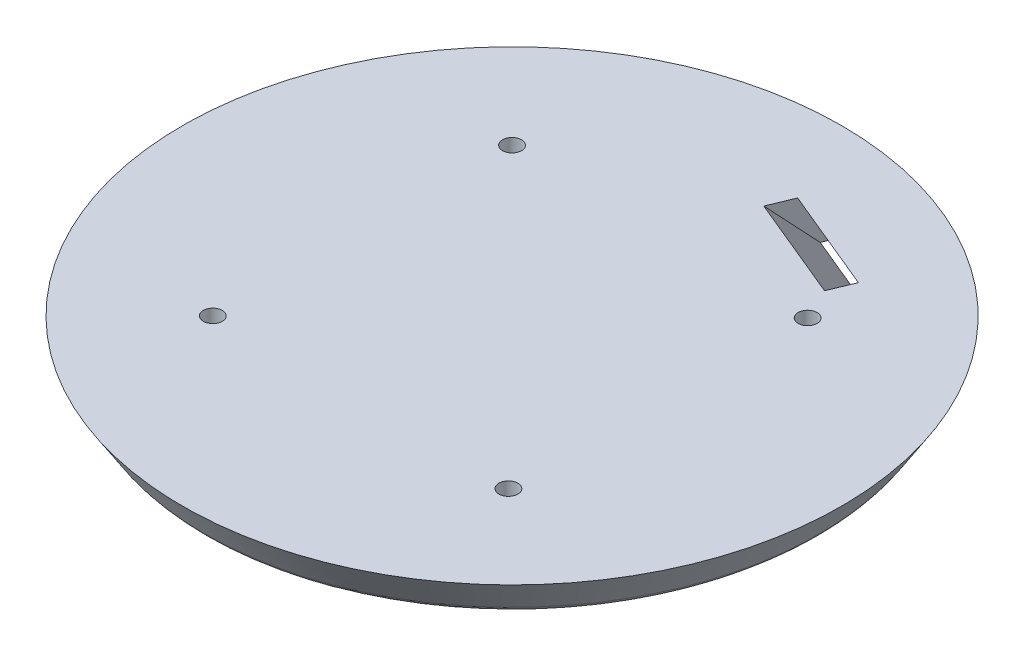
ISO-10303-21;
HEADER;
FILE_DESCRIPTION(('STEP AP214'),'2;1');
FILE_NAME('part.step','',(''),(''),'','','');
FILE_SCHEMA(('AUTOMOTIVE_DESIGN { 1 0 10303 214 1 1 1 1 }'));
ENDSEC;
DATA;
#1=APPLICATION_CONTEXT('core data for automotive mechanical design processes');
#2=APPLICATION_PROTOCOL_DEFINITION('international standard','automotive_design',2000,#1);
#3=PRODUCT_CONTEXT('',#1,'mechanical');
#4=PRODUCT('Part','Part','',(#3));
#5=PRODUCT_RELATED_PRODUCT_CATEGORY('part','',(#4));
#6=PRODUCT_DEFINITION_FORMATION('','',#4);
#7=PRODUCT_DEFINITION_CONTEXT('part definition',#1,'design');
#8=PRODUCT_DEFINITION('design','',#6,#7);
#9=PRODUCT_DEFINITION_SHAPE('','',#8);
#10=(LENGTH_UNIT() NAMED_UNIT(*) SI_UNIT(.MILLI.,.METRE.));
#11=(NAMED_UNIT(*) PLANE_ANGLE_UNIT() SI_UNIT($,.RADIAN.));
#12=(NAMED_UNIT(*) SI_UNIT($,.STERADIAN.) SOLID_ANGLE_UNIT());
#13=UNCERTAINTY_MEASURE_WITH_UNIT(LENGTH_MEASURE(1.E-05),#10,'distance_accuracy_value','');
#14=(GEOMETRIC_REPRESENTATION_CONTEXT(3) GLOBAL_UNCERTAINTY_ASSIGNED_CONTEXT((#13)) GLOBAL_UNIT_ASSIGNED_CONTEXT((#10,
#11,#12)) REPRESENTATION_CONTEXT('',''));
#15=CARTESIAN_POINT('',(0.,0.,0.));
#16=DIRECTION('',(0.,0.,1.));
#17=DIRECTION('',(1.,0.,0.));
#18=AXIS2_PLACEMENT_3D('',#15,#16,#17);
#19=CARTESIAN_POINT('',(0.,-9.99999999999999,0.));
#20=DIRECTION('',(0.,1.,0.));
#21=DIRECTION('',(0.,0.,1.));
#22=AXIS2_PLACEMENT_3D('',#19,#20,#21);
#23=PLANE('',#22);
#24=CARTESIAN_POINT('',(0.,-9.99999999999999,0.));
#25=DIRECTION('',(0.,-1.,0.));
#26=DIRECTION('',(0.,0.,-1.));
#27=AXIS2_PLACEMENT_3D('',#24,#25,#26);
#28=CIRCLE('',#27,33.8864389538999);
#29=CARTESIAN_POINT('',(0.,-9.99999999999999,-33.8864389538999));
#30=VERTEX_POINT('',#29);
#31=EDGE_CURVE('E306',#30,#30,#28,.T.);
#32=ORIENTED_EDGE('',*,*,#31,.T.);
#33=EDGE_LOOP('',(#32));
#34=FACE_BOUND('',#33,.T.);
#35=CARTESIAN_POINT('',(-17.3241161390704,-9.99999999999999,17.3241161390704));
#36=DIRECTION('',(0.,1.,0.));
#37=DIRECTION('',(0.,0.,1.));
#38=AXIS2_PLACEMENT_3D('',#35,#36,#37);
#39=CIRCLE('',#38,4.2);
#40=CARTESIAN_POINT('',(-17.3241161390704,-9.99999999999999,21.5241161390704));
#41=VERTEX_POINT('',#40);
#42=EDGE_CURVE('E315',#41,#41,#39,.T.);
#43=ORIENTED_EDGE('',*,*,#42,.T.);
#44=EDGE_LOOP('',(#43));
#45=FACE_BOUND('',#44,.T.);
#46=CARTESIAN_POINT('',(-17.1119841047144,-9.99999999999999,-17.1119841047145));
#47=DIRECTION('',(0.,1.,0.));
#48=DIRECTION('',(0.,0.,1.));
#49=AXIS2_PLACEMENT_3D('',#46,#47,#48);
#50=CIRCLE('',#49,4.2);
#51=CARTESIAN_POINT('',(-17.1119841047144,-9.99999999999999,-12.9119841047145));
#52=VERTEX_POINT('',#51);
#53=EDGE_CURVE('E165',#52,#52,#50,.T.);
#54=ORIENTED_EDGE('',*,*,#53,.T.);
#55=EDGE_LOOP('',(#54));
#56=FACE_BOUND('',#55,.T.);
#57=CARTESIAN_POINT('',(17.3241161390705,-9.99999999999999,-16.8998520703585));
#58=DIRECTION('',(0.,1.,0.));
#59=DIRECTION('',(0.,0.,1.));
#60=AXIS2_PLACEMENT_3D('',#57,#58,#59);
#61=CIRCLE('',#60,4.2);
#62=CARTESIAN_POINT('',(17.3241161390705,-9.99999999999999,-12.6998520703585));
#63=VERTEX_POINT('',#62);
#64=EDGE_CURVE('E322',#63,#63,#61,.T.);
#65=ORIENTED_EDGE('',*,*,#64,.T.);
#66=EDGE_LOOP('',(#65));
#67=FACE_BOUND('',#66,.T.);
#68=CARTESIAN_POINT('',(17.1119841047145,-9.99999999999999,17.5362481734264));
#69=DIRECTION('',(0.,1.,0.));
#70=DIRECTION('',(0.,0.,1.));
#71=AXIS2_PLACEMENT_3D('',#68,#69,#70);
#72=CIRCLE('',#71,4.2);
#73=CARTESIAN_POINT('',(17.1119841047145,-9.99999999999999,21.7362481734264));
#74=VERTEX_POINT('',#73);
#75=EDGE_CURVE('E174',#74,#74,#72,.T.);
#76=ORIENTED_EDGE('',*,*,#75,.T.);
#77=EDGE_LOOP('',(#76));
#78=FACE_BOUND('',#77,.T.);
#79=DIRECTION('',(-0.382683432365088,0.,0.923879532511288));
#80=VECTOR('',#79,1.);
#81=CARTESIAN_POINT('',(17.485719932276,-9.99999999999999,-25.2289436649656));
#82=LINE('',#81,#80);
#83=CARTESIAN_POINT('',(18.6337702293713,-9.99999999999999,-28.0005822624994));
#84=VERTEX_POINT('',#83);
#85=CARTESIAN_POINT('',(17.485719932276,-9.99999999999999,-25.2289436649656));
#86=VERTEX_POINT('',#85);
#87=EDGE_CURVE('E102',#84,#86,#82,.T.);
#88=ORIENTED_EDGE('',*,*,#87,.F.);
#89=DIRECTION('',(0.923879532511288,0.,0.382683432365088));
#90=VECTOR('',#89,1.);
#91=CARTESIAN_POINT('',(6.62333630672452,-9.99999999999999,-32.9754668832456));
#92=LINE('',#91,#90);
#93=CARTESIAN_POINT('',(6.62333630672452,-9.99999999999999,-32.9754668832456));
#94=VERTEX_POINT('',#93);
#95=EDGE_CURVE('E107',#94,#84,#92,.T.);
#96=ORIENTED_EDGE('',*,*,#95,.F.);
#97=DIRECTION('',(0.382683432365088,0.,-0.923879532511288));
#98=VECTOR('',#97,1.);
#99=CARTESIAN_POINT('',(5.47528600962925,-9.99999999999999,-30.2038282857117));
#100=LINE('',#99,#98);
#101=CARTESIAN_POINT('',(5.47528600962925,-9.99999999999999,-30.2038282857117));
#102=VERTEX_POINT('',#101);
#103=EDGE_CURVE('E110',#102,#94,#100,.T.);
#104=ORIENTED_EDGE('',*,*,#103,.F.);
#105=DIRECTION('',(-0.923879532511288,0.,-0.382683432365088));
#106=VECTOR('',#105,1.);
#107=CARTESIAN_POINT('',(5.47528600962925,-9.99999999999999,-30.2038282857117));
#108=LINE('',#107,#106);
#109=EDGE_CURVE('E46',#86,#102,#108,.T.);
#110=ORIENTED_EDGE('',*,*,#109,.F.);
#111=EDGE_LOOP('',(#88,#96,#104,#110));
#112=FACE_BOUND('',#111,.T.);
#113=ADVANCED_FACE('F42',(#34,#45,#56,#67,#78,#112),#23,.F.);
#114=CARTESIAN_POINT('',(0.,-5.,0.));
#115=DIRECTION('',(0.,-1.,0.));
#116=DIRECTION('',(0.,0.,-1.));
#117=AXIS2_PLACEMENT_3D('',#114,#115,#116);
#118=PLANE('',#117);
#119=CARTESIAN_POINT('',(0.,-5.,0.));
#120=DIRECTION('',(0.,-1.,0.));
#121=DIRECTION('',(0.,0.,-1.));
#122=AXIS2_PLACEMENT_3D('',#119,#120,#121);
#123=CIRCLE('',#122,38.16059492175);
#124=CARTESIAN_POINT('',(0.,-5.,-38.16059492175));
#125=VERTEX_POINT('',#124);
#126=EDGE_CURVE('E285',#125,#125,#123,.T.);
#127=ORIENTED_EDGE('',*,*,#126,.F.);
#128=EDGE_LOOP('',(#127));
#129=FACE_BOUND('',#128,.T.);
#130=CARTESIAN_POINT('',(17.3241161390705,-5.,-16.8998520703585));
#131=DIRECTION('',(0.,-1.,0.));
#132=DIRECTION('',(0.,0.,-1.));
#133=AXIS2_PLACEMENT_3D('',#130,#131,#132);
#134=CIRCLE('',#133,1.1);
#135=CARTESIAN_POINT('',(17.3241161390705,-5.,-17.9998520703585));
#136=VERTEX_POINT('',#135);
#137=EDGE_CURVE('E289',#136,#136,#134,.T.);
#138=ORIENTED_EDGE('',*,*,#137,.T.);
#139=EDGE_LOOP('',(#138));
#140=FACE_BOUND('',#139,.T.);
#141=CARTESIAN_POINT('',(17.1119841047145,-5.,17.5362481734264));
#142=DIRECTION('',(0.,-1.,0.));
#143=DIRECTION('',(0.,0.,-1.));
#144=AXIS2_PLACEMENT_3D('',#141,#142,#143);
#145=CIRCLE('',#144,1.1);
#146=CARTESIAN_POINT('',(17.1119841047145,-5.,16.4362481734264));
#147=VERTEX_POINT('',#146);
#148=EDGE_CURVE('E293',#147,#147,#145,.T.);
#149=ORIENTED_EDGE('',*,*,#148,.T.);
#150=EDGE_LOOP('',(#149));
#151=FACE_BOUND('',#150,.T.);
#152=CARTESIAN_POINT('',(-17.1119841047144,-5.,-17.1119841047145));
#153=DIRECTION('',(0.,-1.,0.));
#154=DIRECTION('',(0.,0.,-1.));
#155=AXIS2_PLACEMENT_3D('',#152,#153,#154);
#156=CIRCLE('',#155,1.1);
#157=CARTESIAN_POINT('',(-17.1119841047144,-5.,-18.2119841047145));
#158=VERTEX_POINT('',#157);
#159=EDGE_CURVE('E297',#158,#158,#156,.T.);
#160=ORIENTED_EDGE('',*,*,#159,.T.);
#161=EDGE_LOOP('',(#160));
#162=FACE_BOUND('',#161,.T.);
#163=CARTESIAN_POINT('',(-17.3241161390704,-5.,17.3241161390704));
#164=DIRECTION('',(0.,-1.,0.));
#165=DIRECTION('',(0.,0.,-1.));
#166=AXIS2_PLACEMENT_3D('',#163,#164,#165);
#167=CIRCLE('',#166,1.1);
#168=CARTESIAN_POINT('',(-17.3241161390704,-5.,16.2241161390704));
#169=VERTEX_POINT('',#168);
#170=EDGE_CURVE('E300',#169,#169,#167,.T.);
#171=ORIENTED_EDGE('',*,*,#170,.T.);
#172=EDGE_LOOP('',(#171));
#173=FACE_BOUND('',#172,.T.);
#174=DIRECTION('',(0.382683432365087,0.,-0.923879532511288));
#175=VECTOR('',#174,1.);
#176=CARTESIAN_POINT('',(16.7203530675458,-5.,-23.381184599943));
#177=LINE('',#176,#175);
#178=CARTESIAN_POINT('',(15.5723027704506,-5.,-20.6095460024091));
#179=VERTEX_POINT('',#178);
#180=CARTESIAN_POINT('',(16.7203530675458,-5.,-23.381184599943));
#181=VERTEX_POINT('',#180);
#182=EDGE_CURVE('E222',#179,#181,#177,.T.);
#183=ORIENTED_EDGE('',*,*,#182,.F.);
#184=DIRECTION('',(0.923879532511288,0.,0.382683432365087));
#185=VECTOR('',#184,1.);
#186=CARTESIAN_POINT('',(3.56186884780381,-5.,-25.5844306231553));
#187=LINE('',#186,#185);
#188=CARTESIAN_POINT('',(3.56186884780381,-5.,-25.5844306231553));
#189=VERTEX_POINT('',#188);
#190=EDGE_CURVE('E92',#189,#179,#187,.T.);
#191=ORIENTED_EDGE('',*,*,#190,.F.);
#192=DIRECTION('',(-0.382683432365087,0.,0.923879532511288));
#193=VECTOR('',#192,1.);
#194=CARTESIAN_POINT('',(4.70991914489908,-5.,-28.3560692206891));
#195=LINE('',#194,#193);
#196=CARTESIAN_POINT('',(4.70991914489907,-5.,-28.3560692206891));
#197=VERTEX_POINT('',#196);
#198=EDGE_CURVE('E121',#197,#189,#195,.T.);
#199=ORIENTED_EDGE('',*,*,#198,.F.);
#200=DIRECTION('',(-0.923879532511288,0.,-0.382683432365088));
#201=VECTOR('',#200,1.);
#202=CARTESIAN_POINT('',(4.70991914489908,-5.,-28.3560692206891));
#203=LINE('',#202,#201);
#204=EDGE_CURVE('E182',#181,#197,#203,.T.);
#205=ORIENTED_EDGE('',*,*,#204,.F.);
#206=EDGE_LOOP('',(#183,#191,#199,#205));
#207=FACE_BOUND('',#206,.T.);
#208=ADVANCED_FACE('F132',(#129,#140,#151,#162,#173,#207),#118,.F.);
#209=CARTESIAN_POINT('',(0.,-5.,0.));
#210=DIRECTION('',(0.,1.,0.));
#211=DIRECTION('',(0.,0.,1.));
#212=AXIS2_PLACEMENT_3D('',#209,#210,#211);
#213=CONICAL_SURFACE('',#212,38.16059492175,0.56575802974209);
#214=CARTESIAN_POINT('',(0.,-9.07211177080285,0.));
#215=DIRECTION('',(0.,-1.,0.));
#216=DIRECTION('',(0.,0.,-1.));
#217=AXIS2_PLACEMENT_3D('',#214,#215,#216);
#218=CIRCLE('',#217,35.5748039472902);
#219=CARTESIAN_POINT('',(0.,-9.07211177080285,-35.5748039472902));
#220=VERTEX_POINT('',#219);
#221=EDGE_CURVE('E316',#220,#220,#218,.T.);
#222=ORIENTED_EDGE('',*,*,#221,.F.);
#223=EDGE_LOOP('',(#222));
#224=FACE_BOUND('',#223,.T.);
#225=ORIENTED_EDGE('',*,*,#126,.T.);
#226=EDGE_LOOP('',(#225));
#227=FACE_BOUND('',#226,.T.);
#228=ADVANCED_FACE('F141',(#224,#227),#213,.T.);
#229=CARTESIAN_POINT('',(0.,-7.99999999999999,0.));
#230=DIRECTION('',(0.,-1.,0.));
#231=DIRECTION('',(0.,0.,-1.));
#232=AXIS2_PLACEMENT_3D('',#229,#230,#231);
#233=TOROIDAL_SURFACE('',#232,33.8864389538999,2.);
#234=ORIENTED_EDGE('',*,*,#31,.F.);
#235=EDGE_LOOP('',(#234));
#236=FACE_BOUND('',#235,.T.);
#237=ORIENTED_EDGE('',*,*,#221,.T.);
#238=EDGE_LOOP('',(#237));
#239=FACE_BOUND('',#238,.T.);
#240=ADVANCED_FACE('F136',(#236,#239),#233,.T.);
#241=CARTESIAN_POINT('',(17.3241161390705,32.848531565349,-16.8998520703585));
#242=DIRECTION('',(0.,-1.,0.));
#243=DIRECTION('',(0.,0.,-1.));
#244=AXIS2_PLACEMENT_3D('',#241,#242,#243);
#245=CYLINDRICAL_SURFACE('',#244,1.1);
#246=ORIENTED_EDGE('',*,*,#137,.F.);
#247=EDGE_LOOP('',(#246));
#248=FACE_BOUND('',#247,.T.);
#249=CARTESIAN_POINT('',(17.3241161390705,-13.730954280079,-16.8998520703585));
#250=DIRECTION('',(0.,1.,0.));
#251=DIRECTION('',(0.,0.,1.));
#252=AXIS2_PLACEMENT_3D('',#249,#250,#251);
#253=CIRCLE('',#252,1.1);
#254=CARTESIAN_POINT('',(17.3241161390705,-13.730954280079,-15.7998520703585));
#255=VERTEX_POINT('',#254);
#256=EDGE_CURVE('E219',#255,#255,#253,.T.);
#257=ORIENTED_EDGE('',*,*,#256,.F.);
#258=EDGE_LOOP('',(#257));
#259=FACE_BOUND('',#258,.T.);
#260=ADVANCED_FACE('F140',(#248,#259),#245,.F.);
#261=CARTESIAN_POINT('',(17.1119841047145,32.848531565349,17.5362481734264));
#262=DIRECTION('',(0.,-1.,0.));
#263=DIRECTION('',(0.,0.,-1.));
#264=AXIS2_PLACEMENT_3D('',#261,#262,#263);
#265=CYLINDRICAL_SURFACE('',#264,1.1);
#266=ORIENTED_EDGE('',*,*,#148,.F.);
#267=EDGE_LOOP('',(#266));
#268=FACE_BOUND('',#267,.T.);
#269=CARTESIAN_POINT('',(17.1119841047145,-13.730954280079,17.5362481734264));
#270=DIRECTION('',(0.,1.,0.));
#271=DIRECTION('',(0.,0.,1.));
#272=AXIS2_PLACEMENT_3D('',#269,#270,#271);
#273=CIRCLE('',#272,1.1);
#274=CARTESIAN_POINT('',(17.1119841047145,-13.730954280079,18.6362481734264));
#275=VERTEX_POINT('',#274);
#276=EDGE_CURVE('E344',#275,#275,#273,.T.);
#277=ORIENTED_EDGE('',*,*,#276,.F.);
#278=EDGE_LOOP('',(#277));
#279=FACE_BOUND('',#278,.T.);
#280=ADVANCED_FACE('F400',(#268,#279),#265,.F.);
#281=CARTESIAN_POINT('',(-17.1119841047144,32.848531565349,-17.1119841047145));
#282=DIRECTION('',(0.,-1.,0.));
#283=DIRECTION('',(0.,0.,-1.));
#284=AXIS2_PLACEMENT_3D('',#281,#282,#283);
#285=CYLINDRICAL_SURFACE('',#284,1.1);
#286=ORIENTED_EDGE('',*,*,#159,.F.);
#287=EDGE_LOOP('',(#286));
#288=FACE_BOUND('',#287,.T.);
#289=CARTESIAN_POINT('',(-17.1119841047144,-13.730954280079,-17.1119841047145));
#290=DIRECTION('',(0.,1.,0.));
#291=DIRECTION('',(0.,0.,1.));
#292=AXIS2_PLACEMENT_3D('',#289,#290,#291);
#293=CIRCLE('',#292,1.1);
#294=CARTESIAN_POINT('',(-17.1119841047144,-13.730954280079,-16.0119841047145));
#295=VERTEX_POINT('',#294);
#296=EDGE_CURVE('E358',#295,#295,#293,.T.);
#297=ORIENTED_EDGE('',*,*,#296,.F.);
#298=EDGE_LOOP('',(#297));
#299=FACE_BOUND('',#298,.T.);
#300=ADVANCED_FACE('F407',(#288,#299),#285,.F.);
#301=CARTESIAN_POINT('',(-17.3241161390704,32.848531565349,17.3241161390704));
#302=DIRECTION('',(0.,-1.,0.));
#303=DIRECTION('',(0.,0.,-1.));
#304=AXIS2_PLACEMENT_3D('',#301,#302,#303);
#305=CYLINDRICAL_SURFACE('',#304,1.1);
#306=ORIENTED_EDGE('',*,*,#170,.F.);
#307=EDGE_LOOP('',(#306));
#308=FACE_BOUND('',#307,.T.);
#309=CARTESIAN_POINT('',(-17.3241161390704,-13.730954280079,17.3241161390704));
#310=DIRECTION('',(0.,1.,0.));
#311=DIRECTION('',(0.,0.,1.));
#312=AXIS2_PLACEMENT_3D('',#309,#310,#311);
#313=CIRCLE('',#312,1.1);
#314=CARTESIAN_POINT('',(-17.3241161390704,-13.730954280079,18.4241161390704));
#315=VERTEX_POINT('',#314);
#316=EDGE_CURVE('E343',#315,#315,#313,.T.);
#317=ORIENTED_EDGE('',*,*,#316,.F.);
#318=EDGE_LOOP('',(#317));
#319=FACE_BOUND('',#318,.T.);
#320=ADVANCED_FACE('F413',(#308,#319),#305,.F.);
#321=CARTESIAN_POINT('',(0.,-13.730954280079,0.));
#322=DIRECTION('',(0.,1.,0.));
#323=DIRECTION('',(0.,0.,1.));
#324=AXIS2_PLACEMENT_3D('',#321,#322,#323);
#325=PLANE('',#324);
#326=ORIENTED_EDGE('',*,*,#296,.T.);
#327=EDGE_LOOP('',(#326));
#328=FACE_BOUND('',#327,.T.);
#329=CARTESIAN_POINT('',(-17.1119841047144,-13.730954280079,-17.1119841047145));
#330=DIRECTION('',(0.,1.,0.));
#331=DIRECTION('',(0.,0.,1.));
#332=AXIS2_PLACEMENT_3D('',#329,#330,#331);
#333=CIRCLE('',#332,2.2);
#334=CARTESIAN_POINT('',(-17.1119841047144,-13.730954280079,-14.9119841047145));
#335=VERTEX_POINT('',#334);
#336=EDGE_CURVE('E360',#335,#335,#333,.T.);
#337=ORIENTED_EDGE('',*,*,#336,.F.);
#338=EDGE_LOOP('',(#337));
#339=FACE_BOUND('',#338,.T.);
#340=ADVANCED_FACE('F417',(#328,#339),#325,.F.);
#341=CARTESIAN_POINT('',(-17.1119841047144,-72.002,-17.1119841047145));
#342=DIRECTION('',(0.,1.,0.));
#343=DIRECTION('',(0.,0.,1.));
#344=AXIS2_PLACEMENT_3D('',#341,#342,#343);
#345=CYLINDRICAL_SURFACE('',#344,2.2);
#346=CARTESIAN_POINT('',(-17.1119841047144,-12.,-17.1119841047145));
#347=DIRECTION('',(0.,1.,0.));
#348=DIRECTION('',(0.,0.,1.));
#349=AXIS2_PLACEMENT_3D('',#346,#347,#348);
#350=CIRCLE('',#349,2.2);
#351=CARTESIAN_POINT('',(-17.1119841047144,-12.,-14.9119841047145));
#352=VERTEX_POINT('',#351);
#353=EDGE_CURVE('E53',#352,#352,#350,.F.);
#354=ORIENTED_EDGE('',*,*,#353,.T.);
#355=EDGE_LOOP('',(#354));
#356=FACE_BOUND('',#355,.T.);
#357=ORIENTED_EDGE('',*,*,#336,.T.);
#358=EDGE_LOOP('',(#357));
#359=FACE_BOUND('',#358,.T.);
#360=ADVANCED_FACE('F418',(#356,#359),#345,.T.);
#361=CARTESIAN_POINT('',(0.,-13.730954280079,0.));
#362=DIRECTION('',(0.,1.,0.));
#363=DIRECTION('',(0.,0.,1.));
#364=AXIS2_PLACEMENT_3D('',#361,#362,#363);
#365=PLANE('',#364);
#366=ORIENTED_EDGE('',*,*,#316,.T.);
#367=EDGE_LOOP('',(#366));
#368=FACE_BOUND('',#367,.T.);
#369=CARTESIAN_POINT('',(-17.3241161390704,-13.730954280079,17.3241161390704));
#370=DIRECTION('',(0.,1.,0.));
#371=DIRECTION('',(0.,0.,1.));
#372=AXIS2_PLACEMENT_3D('',#369,#370,#371);
#373=CIRCLE('',#372,2.2);
#374=CARTESIAN_POINT('',(-17.3241161390704,-13.730954280079,19.5241161390704));
#375=VERTEX_POINT('',#374);
#376=EDGE_CURVE('E349',#375,#375,#373,.T.);
#377=ORIENTED_EDGE('',*,*,#376,.F.);
#378=EDGE_LOOP('',(#377));
#379=FACE_BOUND('',#378,.T.);
#380=ADVANCED_FACE('F421',(#368,#379),#365,.F.);
#381=CARTESIAN_POINT('',(-17.3241161390704,-72.002,17.3241161390704));
#382=DIRECTION('',(0.,1.,0.));
#383=DIRECTION('',(0.,0.,1.));
#384=AXIS2_PLACEMENT_3D('',#381,#382,#383);
#385=CYLINDRICAL_SURFACE('',#384,2.2);
#386=CARTESIAN_POINT('',(-17.3241161390704,-12.,17.3241161390704));
#387=DIRECTION('',(0.,1.,0.));
#388=DIRECTION('',(0.,0.,1.));
#389=AXIS2_PLACEMENT_3D('',#386,#387,#388);
#390=CIRCLE('',#389,2.2);
#391=CARTESIAN_POINT('',(-17.3241161390704,-12.,19.5241161390704));
#392=VERTEX_POINT('',#391);
#393=EDGE_CURVE('E11',#392,#392,#390,.F.);
#394=ORIENTED_EDGE('',*,*,#393,.T.);
#395=EDGE_LOOP('',(#394));
#396=FACE_BOUND('',#395,.T.);
#397=ORIENTED_EDGE('',*,*,#376,.T.);
#398=EDGE_LOOP('',(#397));
#399=FACE_BOUND('',#398,.T.);
#400=ADVANCED_FACE('F425',(#396,#399),#385,.T.);
#401=CARTESIAN_POINT('',(0.,-13.730954280079,0.));
#402=DIRECTION('',(0.,1.,0.));
#403=DIRECTION('',(0.,0.,1.));
#404=AXIS2_PLACEMENT_3D('',#401,#402,#403);
#405=PLANE('',#404);
#406=ORIENTED_EDGE('',*,*,#276,.T.);
#407=EDGE_LOOP('',(#406));
#408=FACE_BOUND('',#407,.T.);
#409=CARTESIAN_POINT('',(17.1119841047145,-13.730954280079,17.5362481734264));
#410=DIRECTION('',(0.,1.,0.));
#411=DIRECTION('',(0.,0.,1.));
#412=AXIS2_PLACEMENT_3D('',#409,#410,#411);
#413=CIRCLE('',#412,2.2);
#414=CARTESIAN_POINT('',(17.1119841047145,-13.730954280079,19.7362481734264));
#415=VERTEX_POINT('',#414);
#416=EDGE_CURVE('E340',#415,#415,#413,.T.);
#417=ORIENTED_EDGE('',*,*,#416,.F.);
#418=EDGE_LOOP('',(#417));
#419=FACE_BOUND('',#418,.T.);
#420=ADVANCED_FACE('F336',(#408,#419),#405,.F.);
#421=CARTESIAN_POINT('',(17.1119841047145,-72.002,17.5362481734264));
#422=DIRECTION('',(0.,1.,0.));
#423=DIRECTION('',(0.,0.,1.));
#424=AXIS2_PLACEMENT_3D('',#421,#422,#423);
#425=CYLINDRICAL_SURFACE('',#424,2.2);
#426=CARTESIAN_POINT('',(17.1119841047145,-12.,17.5362481734264));
#427=DIRECTION('',(0.,1.,0.));
#428=DIRECTION('',(0.,0.,1.));
#429=AXIS2_PLACEMENT_3D('',#426,#427,#428);
#430=CIRCLE('',#429,2.2);
#431=CARTESIAN_POINT('',(17.1119841047145,-12.,19.7362481734264));
#432=VERTEX_POINT('',#431);
#433=EDGE_CURVE('E311',#432,#432,#430,.F.);
#434=ORIENTED_EDGE('',*,*,#433,.T.);
#435=EDGE_LOOP('',(#434));
#436=FACE_BOUND('',#435,.T.);
#437=ORIENTED_EDGE('',*,*,#416,.T.);
#438=EDGE_LOOP('',(#437));
#439=FACE_BOUND('',#438,.T.);
#440=ADVANCED_FACE('F332',(#436,#439),#425,.T.);
#441=CARTESIAN_POINT('',(0.,-13.730954280079,0.));
#442=DIRECTION('',(0.,1.,0.));
#443=DIRECTION('',(0.,0.,1.));
#444=AXIS2_PLACEMENT_3D('',#441,#442,#443);
#445=PLANE('',#444);
#446=ORIENTED_EDGE('',*,*,#256,.T.);
#447=EDGE_LOOP('',(#446));
#448=FACE_BOUND('',#447,.T.);
#449=CARTESIAN_POINT('',(17.3241161390705,-13.730954280079,-16.8998520703585));
#450=DIRECTION('',(0.,1.,0.));
#451=DIRECTION('',(0.,0.,1.));
#452=AXIS2_PLACEMENT_3D('',#449,#450,#451);
#453=CIRCLE('',#452,2.2);
#454=CARTESIAN_POINT('',(17.3241161390705,-13.730954280079,-14.6998520703585));
#455=VERTEX_POINT('',#454);
#456=EDGE_CURVE('E352',#455,#455,#453,.T.);
#457=ORIENTED_EDGE('',*,*,#456,.F.);
#458=EDGE_LOOP('',(#457));
#459=FACE_BOUND('',#458,.T.);
#460=ADVANCED_FACE('F335',(#448,#459),#445,.F.);
#461=CARTESIAN_POINT('',(17.3241161390705,-72.002,-16.8998520703585));
#462=DIRECTION('',(0.,1.,0.));
#463=DIRECTION('',(0.,0.,1.));
#464=AXIS2_PLACEMENT_3D('',#461,#462,#463);
#465=CYLINDRICAL_SURFACE('',#464,2.2);
#466=CARTESIAN_POINT('',(17.3241161390705,-12.,-16.8998520703585));
#467=DIRECTION('',(0.,1.,0.));
#468=DIRECTION('',(0.,0.,1.));
#469=AXIS2_PLACEMENT_3D('',#466,#467,#468);
#470=CIRCLE('',#469,2.2);
#471=CARTESIAN_POINT('',(17.3241161390705,-12.,-14.6998520703585));
#472=VERTEX_POINT('',#471);
#473=EDGE_CURVE('E170',#472,#472,#470,.F.);
#474=ORIENTED_EDGE('',*,*,#473,.T.);
#475=EDGE_LOOP('',(#474));
#476=FACE_BOUND('',#475,.T.);
#477=ORIENTED_EDGE('',*,*,#456,.T.);
#478=EDGE_LOOP('',(#477));
#479=FACE_BOUND('',#478,.T.);
#480=ADVANCED_FACE('F150',(#476,#479),#465,.T.);
#481=CARTESIAN_POINT('',(17.1119841047145,-12.,17.5362481734264));
#482=DIRECTION('',(0.,1.,0.));
#483=DIRECTION('',(0.,0.,1.));
#484=AXIS2_PLACEMENT_3D('',#481,#482,#483);
#485=TOROIDAL_SURFACE('',#484,4.2,2.);
#486=ORIENTED_EDGE('',*,*,#75,.F.);
#487=EDGE_LOOP('',(#486));
#488=FACE_BOUND('',#487,.T.);
#489=ORIENTED_EDGE('',*,*,#433,.F.);
#490=EDGE_LOOP('',(#489));
#491=FACE_BOUND('',#490,.T.);
#492=ADVANCED_FACE('F146',(#488,#491),#485,.F.);
#493=CARTESIAN_POINT('',(17.3241161390705,-12.,-16.8998520703585));
#494=DIRECTION('',(0.,1.,0.));
#495=DIRECTION('',(0.,0.,1.));
#496=AXIS2_PLACEMENT_3D('',#493,#494,#495);
#497=TOROIDAL_SURFACE('',#496,4.2,2.);
#498=ORIENTED_EDGE('',*,*,#64,.F.);
#499=EDGE_LOOP('',(#498));
#500=FACE_BOUND('',#499,.T.);
#501=ORIENTED_EDGE('',*,*,#473,.F.);
#502=EDGE_LOOP('',(#501));
#503=FACE_BOUND('',#502,.T.);
#504=ADVANCED_FACE('F149',(#500,#503),#497,.F.);
#505=CARTESIAN_POINT('',(-17.1119841047144,-12.,-17.1119841047145));
#506=DIRECTION('',(0.,1.,0.));
#507=DIRECTION('',(0.,0.,1.));
#508=AXIS2_PLACEMENT_3D('',#505,#506,#507);
#509=TOROIDAL_SURFACE('',#508,4.2,2.);
#510=ORIENTED_EDGE('',*,*,#53,.F.);
#511=EDGE_LOOP('',(#510));
#512=FACE_BOUND('',#511,.T.);
#513=ORIENTED_EDGE('',*,*,#353,.F.);
#514=EDGE_LOOP('',(#513));
#515=FACE_BOUND('',#514,.T.);
#516=ADVANCED_FACE('F153',(#512,#515),#509,.F.);
#517=CARTESIAN_POINT('',(-17.3241161390704,-12.,17.3241161390704));
#518=DIRECTION('',(0.,1.,0.));
#519=DIRECTION('',(0.,0.,1.));
#520=AXIS2_PLACEMENT_3D('',#517,#518,#519);
#521=TOROIDAL_SURFACE('',#520,4.2,2.);
#522=ORIENTED_EDGE('',*,*,#42,.F.);
#523=EDGE_LOOP('',(#522));
#524=FACE_BOUND('',#523,.T.);
#525=ORIENTED_EDGE('',*,*,#393,.F.);
#526=EDGE_LOOP('',(#525));
#527=FACE_BOUND('',#526,.T.);
#528=ADVANCED_FACE('F44',(#524,#527),#521,.F.);
#529=CARTESIAN_POINT('',(6.00521696132338,0.,2.48744231037307));
#530=DIRECTION('',(-0.923879532511288,0.,-0.382683432365087));
#531=DIRECTION('',(-0.382683432365087,0.,0.923879532511288));
#532=AXIS2_PLACEMENT_3D('',#529,#530,#531);
#533=PLANE('',#532);
#534=DIRECTION('',(-0.270598050073098,0.707106781186547,0.653281482438189));
#535=VECTOR('',#534,1.);
#536=CARTESIAN_POINT('',(18.6337702293713,-9.99999999999999,-28.0005822624994));
#537=LINE('',#536,#535);
#538=EDGE_CURVE('E98',#84,#181,#537,.T.);
#539=ORIENTED_EDGE('',*,*,#538,.F.);
#540=ORIENTED_EDGE('',*,*,#87,.T.);
#541=DIRECTION('',(-0.270598050073097,0.707106781186547,0.653281482438189));
#542=VECTOR('',#541,1.);
#543=CARTESIAN_POINT('',(17.485719932276,-9.99999999999999,-25.2289436649656));
#544=LINE('',#543,#542);
#545=EDGE_CURVE('E85',#86,#179,#544,.T.);
#546=ORIENTED_EDGE('',*,*,#545,.T.);
#547=ORIENTED_EDGE('',*,*,#182,.T.);
#548=EDGE_LOOP('',(#539,#540,#546,#547));
#549=FACE_BOUND('',#548,.T.);
#550=ADVANCED_FACE('F103',(#549),#533,.T.);
#551=CARTESIAN_POINT('',(3.82683432365087,10.,-9.23879532511288));
#552=DIRECTION('',(0.270598050073097,0.707106781186548,-0.653281482438189));
#553=DIRECTION('',(0.,0.678598344545847,0.734509555267755));
#554=AXIS2_PLACEMENT_3D('',#551,#552,#553);
#555=PLANE('',#554);
#556=ORIENTED_EDGE('',*,*,#545,.F.);
#557=ORIENTED_EDGE('',*,*,#109,.T.);
#558=DIRECTION('',(-0.270598050073097,0.707106781186547,0.653281482438189));
#559=VECTOR('',#558,1.);
#560=CARTESIAN_POINT('',(5.47528600962925,-9.99999999999999,-30.2038282857117));
#561=LINE('',#560,#559);
#562=EDGE_CURVE('E61',#102,#189,#561,.T.);
#563=ORIENTED_EDGE('',*,*,#562,.T.);
#564=ORIENTED_EDGE('',*,*,#190,.T.);
#565=EDGE_LOOP('',(#556,#557,#563,#564));
#566=FACE_BOUND('',#565,.T.);
#567=ADVANCED_FACE('F87',(#566),#555,.T.);
#568=CARTESIAN_POINT('',(4.4008594721985,11.5,-10.6246146238798));
#569=DIRECTION('',(-0.270598050073097,-0.707106781186548,0.653281482438189));
#570=DIRECTION('',(0.,-0.678598344545847,-0.734509555267756));
#571=AXIS2_PLACEMENT_3D('',#568,#569,#570);
#572=PLANE('',#571);
#573=DIRECTION('',(-0.270598050073097,0.707106781186547,0.653281482438189));
#574=VECTOR('',#573,1.);
#575=CARTESIAN_POINT('',(6.62333630672452,-9.99999999999999,-32.9754668832456));
#576=LINE('',#575,#574);
#577=EDGE_CURVE('E66',#94,#197,#576,.T.);
#578=ORIENTED_EDGE('',*,*,#577,.F.);
#579=ORIENTED_EDGE('',*,*,#95,.T.);
#580=ORIENTED_EDGE('',*,*,#538,.T.);
#581=ORIENTED_EDGE('',*,*,#204,.T.);
#582=EDGE_LOOP('',(#578,#579,#580,#581));
#583=FACE_BOUND('',#582,.T.);
#584=ADVANCED_FACE('F246',(#583),#572,.T.);
#585=CARTESIAN_POINT('',(-6.00521696132337,0.,-2.48744231037307));
#586=DIRECTION('',(0.923879532511288,0.,0.382683432365087));
#587=DIRECTION('',(0.382683432365087,0.,-0.923879532511288));
#588=AXIS2_PLACEMENT_3D('',#585,#586,#587);
#589=PLANE('',#588);
#590=ORIENTED_EDGE('',*,*,#562,.F.);
#591=ORIENTED_EDGE('',*,*,#103,.T.);
#592=ORIENTED_EDGE('',*,*,#577,.T.);
#593=ORIENTED_EDGE('',*,*,#198,.T.);
#594=EDGE_LOOP('',(#590,#591,#592,#593));
#595=FACE_BOUND('',#594,.T.);
#596=ADVANCED_FACE('F228',(#595),#589,.T.);
#597=CLOSED_SHELL('',(#113,#208,#228,#240,#260,#280,#300,#320,#340,#360,#380,#400,#420,#440,
#460,#480,#492,#504,#516,#528,#550,#567,#584,#596));
#598=MANIFOLD_SOLID_BREP('B2',#597);
#599=ADVANCED_BREP_SHAPE_REPRESENTATION('',(#18,#598),#14);
#600=SHAPE_DEFINITION_REPRESENTATION(#9,#599);
ENDSEC;
END-ISO-10303-21;
